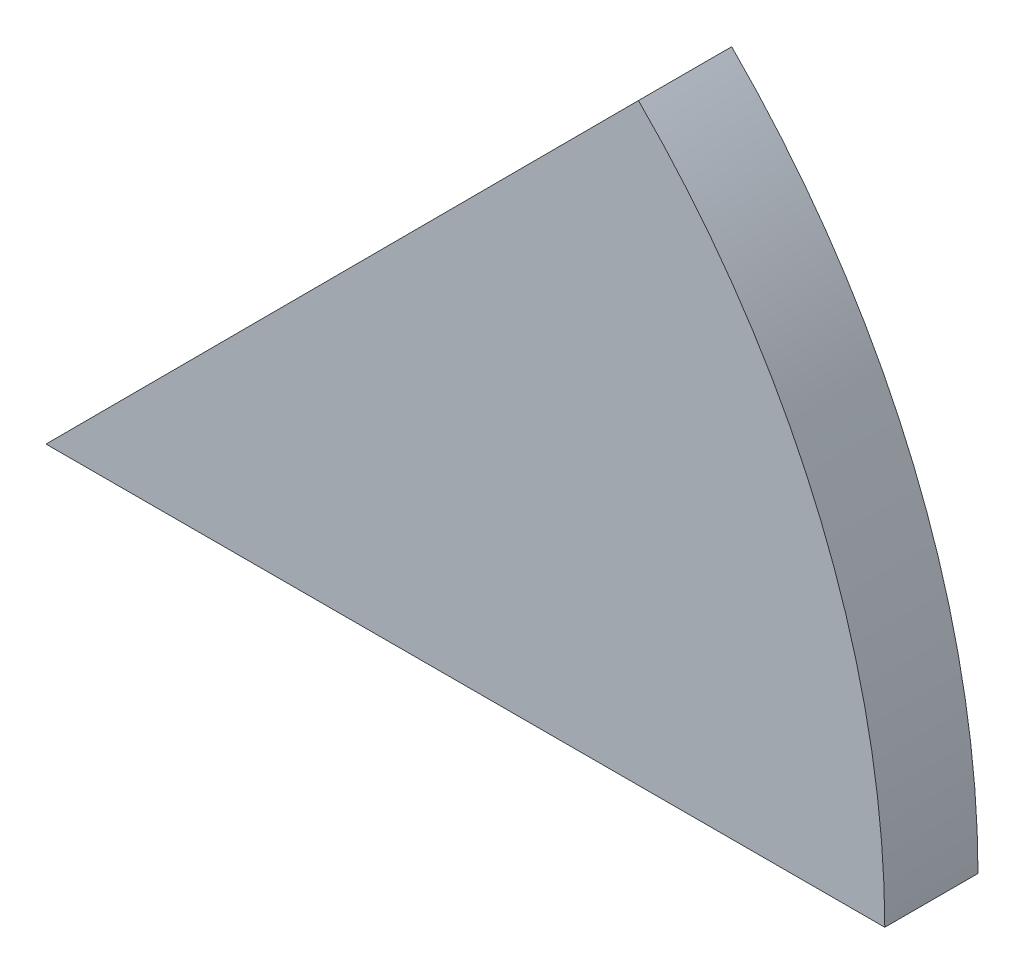
ISO-10303-21;
HEADER;
FILE_DESCRIPTION(('STEP AP214'),'2;1');
FILE_NAME('part.step','',(''),(''),'','','');
FILE_SCHEMA(('AUTOMOTIVE_DESIGN { 1 0 10303 214 1 1 1 1 }'));
ENDSEC;
DATA;
#1=APPLICATION_CONTEXT('core data for automotive mechanical design processes');
#2=APPLICATION_PROTOCOL_DEFINITION('international standard','automotive_design',2000,#1);
#3=PRODUCT_CONTEXT('',#1,'mechanical');
#4=PRODUCT('Part','Part','',(#3));
#5=PRODUCT_RELATED_PRODUCT_CATEGORY('part','',(#4));
#6=PRODUCT_DEFINITION_FORMATION('','',#4);
#7=PRODUCT_DEFINITION_CONTEXT('part definition',#1,'design');
#8=PRODUCT_DEFINITION('design','',#6,#7);
#9=PRODUCT_DEFINITION_SHAPE('','',#8);
#10=(LENGTH_UNIT() NAMED_UNIT(*) SI_UNIT(.MILLI.,.METRE.));
#11=(NAMED_UNIT(*) PLANE_ANGLE_UNIT() SI_UNIT($,.RADIAN.));
#12=(NAMED_UNIT(*) SI_UNIT($,.STERADIAN.) SOLID_ANGLE_UNIT());
#13=UNCERTAINTY_MEASURE_WITH_UNIT(LENGTH_MEASURE(1.E-05),#10,'distance_accuracy_value','');
#14=(GEOMETRIC_REPRESENTATION_CONTEXT(3) GLOBAL_UNCERTAINTY_ASSIGNED_CONTEXT((#13)) GLOBAL_UNIT_ASSIGNED_CONTEXT((#10,
#11,#12)) REPRESENTATION_CONTEXT('',''));
#15=CARTESIAN_POINT('',(0.,0.,0.));
#16=DIRECTION('',(0.,0.,1.));
#17=DIRECTION('',(1.,0.,0.));
#18=AXIS2_PLACEMENT_3D('',#15,#16,#17);
#19=CARTESIAN_POINT('',(0.,0.,25.4));
#20=DIRECTION('',(0.707880843742746,-0.706331870342871,0.));
#21=DIRECTION('',(0.706331870342871,0.707880843742746,0.));
#22=AXIS2_PLACEMENT_3D('',#19,#20,#21);
#23=PLANE('',#22);
#24=DIRECTION('',(-0.706331870342871,-0.707880843742746,0.));
#25=VECTOR('',#24,1.);
#26=CARTESIAN_POINT('',(0.,0.,0.));
#27=LINE('',#26,#25);
#28=CARTESIAN_POINT('',(161.46746556038,161.821560879592,0.));
#29=VERTEX_POINT('',#28);
#30=CARTESIAN_POINT('',(0.,0.,0.));
#31=VERTEX_POINT('',#30);
#32=EDGE_CURVE('E84',#29,#31,#27,.T.);
#33=ORIENTED_EDGE('',*,*,#32,.T.);
#34=DIRECTION('',(0.,0.,-1.));
#35=VECTOR('',#34,1.);
#36=CARTESIAN_POINT('',(0.,0.,25.4));
#37=LINE('',#36,#35);
#38=CARTESIAN_POINT('',(0.,0.,25.4));
#39=VERTEX_POINT('',#38);
#40=EDGE_CURVE('E11',#39,#31,#37,.T.);
#41=ORIENTED_EDGE('',*,*,#40,.F.);
#42=DIRECTION('',(-0.706331870342871,-0.707880843742746,0.));
#43=VECTOR('',#42,1.);
#44=CARTESIAN_POINT('',(0.,0.,25.4));
#45=LINE('',#44,#43);
#46=CARTESIAN_POINT('',(161.46746556038,161.821560879592,25.4));
#47=VERTEX_POINT('',#46);
#48=EDGE_CURVE('E77',#47,#39,#45,.T.);
#49=ORIENTED_EDGE('',*,*,#48,.F.);
#50=DIRECTION('',(0.,0.,-1.));
#51=VECTOR('',#50,1.);
#52=CARTESIAN_POINT('',(161.46746556038,161.821560879592,25.4));
#53=LINE('',#52,#51);
#54=EDGE_CURVE('E85',#47,#29,#53,.T.);
#55=ORIENTED_EDGE('',*,*,#54,.T.);
#56=EDGE_LOOP('',(#33,#41,#49,#55));
#57=FACE_BOUND('',#56,.T.);
#58=ADVANCED_FACE('F37',(#57),#23,.F.);
#59=CARTESIAN_POINT('',(0.,0.,25.4));
#60=DIRECTION('',(-0.00109528959492722,0.999999400170172,0.));
#61=DIRECTION('',(-0.999999400170172,-0.00109528959492722,0.));
#62=AXIS2_PLACEMENT_3D('',#59,#60,#61);
#63=PLANE('',#62);
#64=DIRECTION('',(0.999999400170172,0.00109528959492722,0.));
#65=VECTOR('',#64,1.);
#66=CARTESIAN_POINT('',(0.,0.,0.));
#67=LINE('',#66,#65);
#68=CARTESIAN_POINT('',(228.599862878901,0.250383201400362,0.));
#69=VERTEX_POINT('',#68);
#70=EDGE_CURVE('E65',#31,#69,#67,.T.);
#71=ORIENTED_EDGE('',*,*,#70,.T.);
#72=DIRECTION('',(0.,0.,-1.));
#73=VECTOR('',#72,1.);
#74=CARTESIAN_POINT('',(228.599862878901,0.250383201400362,25.4));
#75=LINE('',#74,#73);
#76=CARTESIAN_POINT('',(228.599862878901,0.250383201400362,25.4));
#77=VERTEX_POINT('',#76);
#78=EDGE_CURVE('E45',#77,#69,#75,.T.);
#79=ORIENTED_EDGE('',*,*,#78,.F.);
#80=DIRECTION('',(0.999999400170172,0.00109528959492722,0.));
#81=VECTOR('',#80,1.);
#82=CARTESIAN_POINT('',(0.,0.,25.4));
#83=LINE('',#82,#81);
#84=EDGE_CURVE('E73',#39,#77,#83,.T.);
#85=ORIENTED_EDGE('',*,*,#84,.F.);
#86=ORIENTED_EDGE('',*,*,#40,.T.);
#87=EDGE_LOOP('',(#71,#79,#85,#86));
#88=FACE_BOUND('',#87,.T.);
#89=ADVANCED_FACE('F74',(#88),#63,.F.);
#90=CARTESIAN_POINT('',(0.,0.,25.4));
#91=DIRECTION('',(0.,0.,-1.));
#92=DIRECTION('',(-1.,0.,0.));
#93=AXIS2_PLACEMENT_3D('',#90,#91,#92);
#94=CYLINDRICAL_SURFACE('',#93,228.6);
#95=CARTESIAN_POINT('',(0.,0.,0.));
#96=DIRECTION('',(0.,0.,1.));
#97=DIRECTION('',(1.,0.,0.));
#98=AXIS2_PLACEMENT_3D('',#95,#96,#97);
#99=CIRCLE('',#98,228.6);
#100=EDGE_CURVE('E70',#69,#29,#99,.T.);
#101=ORIENTED_EDGE('',*,*,#100,.T.);
#102=ORIENTED_EDGE('',*,*,#54,.F.);
#103=CARTESIAN_POINT('',(0.,0.,25.4));
#104=DIRECTION('',(0.,0.,1.));
#105=DIRECTION('',(1.,0.,0.));
#106=AXIS2_PLACEMENT_3D('',#103,#104,#105);
#107=CIRCLE('',#106,228.6);
#108=EDGE_CURVE('E53',#77,#47,#107,.T.);
#109=ORIENTED_EDGE('',*,*,#108,.F.);
#110=ORIENTED_EDGE('',*,*,#78,.T.);
#111=EDGE_LOOP('',(#101,#102,#109,#110));
#112=FACE_BOUND('',#111,.T.);
#113=ADVANCED_FACE('F92',(#112),#94,.T.);
#114=CARTESIAN_POINT('',(0.,0.,25.4));
#115=DIRECTION('',(0.,0.,1.));
#116=DIRECTION('',(1.,0.,0.));
#117=AXIS2_PLACEMENT_3D('',#114,#115,#116);
#118=PLANE('',#117);
#119=ORIENTED_EDGE('',*,*,#48,.T.);
#120=ORIENTED_EDGE('',*,*,#84,.T.);
#121=ORIENTED_EDGE('',*,*,#108,.T.);
#122=EDGE_LOOP('',(#119,#120,#121));
#123=FACE_BOUND('',#122,.T.);
#124=ADVANCED_FACE('F80',(#123),#118,.T.);
#125=CARTESIAN_POINT('',(0.,0.,0.));
#126=DIRECTION('',(0.,0.,1.));
#127=DIRECTION('',(1.,0.,0.));
#128=AXIS2_PLACEMENT_3D('',#125,#126,#127);
#129=PLANE('',#128);
#130=ORIENTED_EDGE('',*,*,#32,.F.);
#131=ORIENTED_EDGE('',*,*,#100,.F.);
#132=ORIENTED_EDGE('',*,*,#70,.F.);
#133=EDGE_LOOP('',(#130,#131,#132));
#134=FACE_BOUND('',#133,.T.);
#135=ADVANCED_FACE('F93',(#134),#129,.F.);
#136=CLOSED_SHELL('',(#58,#89,#113,#124,#135));
#137=MANIFOLD_SOLID_BREP('B2',#136);
#138=ADVANCED_BREP_SHAPE_REPRESENTATION('',(#18,#137),#14);
#139=SHAPE_DEFINITION_REPRESENTATION(#9,#138);
ENDSEC;
END-ISO-10303-21;
